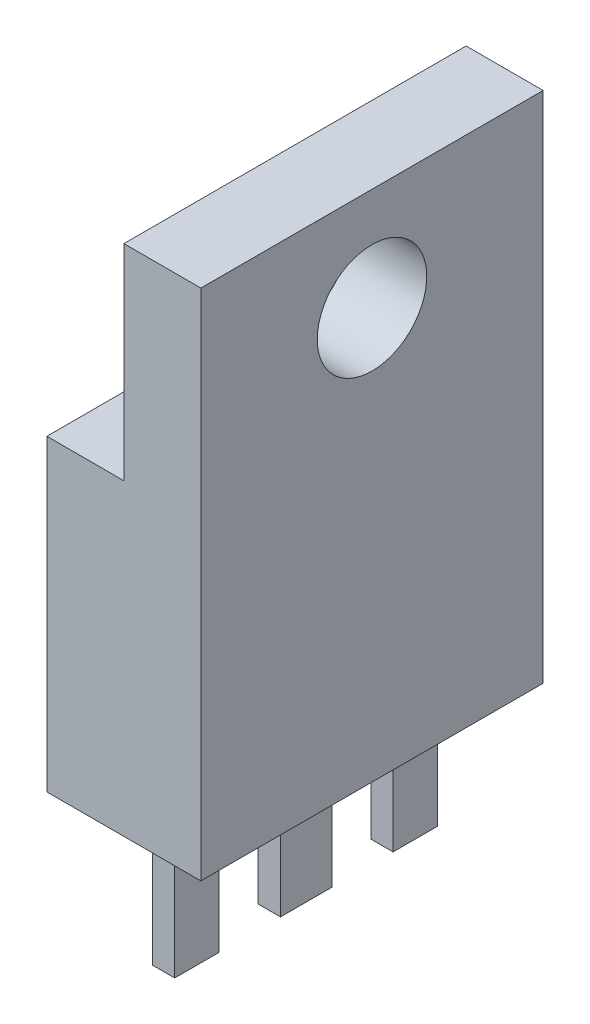
ISO-10303-21;
HEADER;
FILE_DESCRIPTION(('STEP AP214'),'2;1');
FILE_NAME('part.step','',(''),(''),'','','');
FILE_SCHEMA(('AUTOMOTIVE_DESIGN { 1 0 10303 214 1 1 1 1 }'));
ENDSEC;
DATA;
#1=APPLICATION_CONTEXT('core data for automotive mechanical design processes');
#2=APPLICATION_PROTOCOL_DEFINITION('international standard','automotive_design',2000,#1);
#3=PRODUCT_CONTEXT('',#1,'mechanical');
#4=PRODUCT('Part','Part','',(#3));
#5=PRODUCT_RELATED_PRODUCT_CATEGORY('part','',(#4));
#6=PRODUCT_DEFINITION_FORMATION('','',#4);
#7=PRODUCT_DEFINITION_CONTEXT('part definition',#1,'design');
#8=PRODUCT_DEFINITION('design','',#6,#7);
#9=PRODUCT_DEFINITION_SHAPE('','',#8);
#10=(LENGTH_UNIT() NAMED_UNIT(*) SI_UNIT(.MILLI.,.METRE.));
#11=(NAMED_UNIT(*) PLANE_ANGLE_UNIT() SI_UNIT($,.RADIAN.));
#12=(NAMED_UNIT(*) SI_UNIT($,.STERADIAN.) SOLID_ANGLE_UNIT());
#13=UNCERTAINTY_MEASURE_WITH_UNIT(LENGTH_MEASURE(1.E-05),#10,'distance_accuracy_value','');
#14=(GEOMETRIC_REPRESENTATION_CONTEXT(3) GLOBAL_UNCERTAINTY_ASSIGNED_CONTEXT((#13)) GLOBAL_UNIT_ASSIGNED_CONTEXT((#10,
#11,#12)) REPRESENTATION_CONTEXT('',''));
#15=CARTESIAN_POINT('',(0.,0.,0.));
#16=DIRECTION('',(0.,0.,1.));
#17=DIRECTION('',(1.,0.,0.));
#18=AXIS2_PLACEMENT_3D('',#15,#16,#17);
#19=CARTESIAN_POINT('',(0.,0.,0.));
#20=DIRECTION('',(0.,-1.,0.));
#21=DIRECTION('',(0.,0.,-1.));
#22=AXIS2_PLACEMENT_3D('',#19,#20,#21);
#23=PLANE('',#22);
#24=DIRECTION('',(0.,0.,1.));
#25=VECTOR('',#24,1.);
#26=CARTESIAN_POINT('',(0.,0.,0.));
#27=LINE('',#26,#25);
#28=CARTESIAN_POINT('',(0.,0.,-10.));
#29=VERTEX_POINT('',#28);
#30=CARTESIAN_POINT('',(0.,0.,0.));
#31=VERTEX_POINT('',#30);
#32=EDGE_CURVE('E277',#29,#31,#27,.T.);
#33=ORIENTED_EDGE('',*,*,#32,.F.);
#34=DIRECTION('',(-1.,0.,0.));
#35=VECTOR('',#34,1.);
#36=CARTESIAN_POINT('',(0.,0.,-10.));
#37=LINE('',#36,#35);
#38=CARTESIAN_POINT('',(4.5,0.,-10.));
#39=VERTEX_POINT('',#38);
#40=EDGE_CURVE('E282',#39,#29,#37,.T.);
#41=ORIENTED_EDGE('',*,*,#40,.F.);
#42=DIRECTION('',(0.,0.,-1.));
#43=VECTOR('',#42,1.);
#44=CARTESIAN_POINT('',(4.5,0.,0.));
#45=LINE('',#44,#43);
#46=CARTESIAN_POINT('',(4.5,0.,0.));
#47=VERTEX_POINT('',#46);
#48=EDGE_CURVE('E291',#47,#39,#45,.T.);
#49=ORIENTED_EDGE('',*,*,#48,.F.);
#50=DIRECTION('',(1.,0.,0.));
#51=VECTOR('',#50,1.);
#52=CARTESIAN_POINT('',(0.,0.,0.));
#53=LINE('',#52,#51);
#54=EDGE_CURVE('E289',#31,#47,#53,.T.);
#55=ORIENTED_EDGE('',*,*,#54,.F.);
#56=EDGE_LOOP('',(#33,#41,#49,#55));
#57=FACE_BOUND('',#56,.T.);
#58=DIRECTION('',(1.,0.,0.));
#59=VECTOR('',#58,1.);
#60=CARTESIAN_POINT('',(1.925,0.,-2.46));
#61=LINE('',#60,#59);
#62=CARTESIAN_POINT('',(1.925,0.,-2.46));
#63=VERTEX_POINT('',#62);
#64=CARTESIAN_POINT('',(2.575,0.,-2.46));
#65=VERTEX_POINT('',#64);
#66=EDGE_CURVE('E237',#63,#65,#61,.T.);
#67=ORIENTED_EDGE('',*,*,#66,.F.);
#68=DIRECTION('',(0.,0.,-1.));
#69=VECTOR('',#68,1.);
#70=CARTESIAN_POINT('',(1.925,0.,-1.16));
#71=LINE('',#70,#69);
#72=CARTESIAN_POINT('',(1.925,0.,-1.16));
#73=VERTEX_POINT('',#72);
#74=EDGE_CURVE('E223',#73,#63,#71,.T.);
#75=ORIENTED_EDGE('',*,*,#74,.F.);
#76=DIRECTION('',(-1.,0.,0.));
#77=VECTOR('',#76,1.);
#78=CARTESIAN_POINT('',(1.925,0.,-1.16));
#79=LINE('',#78,#77);
#80=CARTESIAN_POINT('',(2.575,0.,-1.16));
#81=VERTEX_POINT('',#80);
#82=EDGE_CURVE('E228',#81,#73,#79,.T.);
#83=ORIENTED_EDGE('',*,*,#82,.F.);
#84=DIRECTION('',(0.,0.,1.));
#85=VECTOR('',#84,1.);
#86=CARTESIAN_POINT('',(2.575,0.,-1.16));
#87=LINE('',#86,#85);
#88=EDGE_CURVE('E239',#65,#81,#87,.T.);
#89=ORIENTED_EDGE('',*,*,#88,.F.);
#90=EDGE_LOOP('',(#67,#75,#83,#89));
#91=FACE_BOUND('',#90,.T.);
#92=DIRECTION('',(1.,0.,0.));
#93=VECTOR('',#92,1.);
#94=CARTESIAN_POINT('',(1.925,0.,-5.75));
#95=LINE('',#94,#93);
#96=CARTESIAN_POINT('',(1.925,0.,-5.75));
#97=VERTEX_POINT('',#96);
#98=CARTESIAN_POINT('',(2.575,0.,-5.75));
#99=VERTEX_POINT('',#98);
#100=EDGE_CURVE('E195',#97,#99,#95,.T.);
#101=ORIENTED_EDGE('',*,*,#100,.F.);
#102=DIRECTION('',(0.,0.,-1.));
#103=VECTOR('',#102,1.);
#104=CARTESIAN_POINT('',(1.925,0.,-4.25));
#105=LINE('',#104,#103);
#106=CARTESIAN_POINT('',(1.925,0.,-4.25));
#107=VERTEX_POINT('',#106);
#108=EDGE_CURVE('E192',#107,#97,#105,.T.);
#109=ORIENTED_EDGE('',*,*,#108,.F.);
#110=DIRECTION('',(-1.,0.,0.));
#111=VECTOR('',#110,1.);
#112=CARTESIAN_POINT('',(1.925,0.,-4.25));
#113=LINE('',#112,#111);
#114=CARTESIAN_POINT('',(2.575,0.,-4.25));
#115=VERTEX_POINT('',#114);
#116=EDGE_CURVE('E204',#115,#107,#113,.T.);
#117=ORIENTED_EDGE('',*,*,#116,.F.);
#118=DIRECTION('',(0.,0.,1.));
#119=VECTOR('',#118,1.);
#120=CARTESIAN_POINT('',(2.575,0.,-4.25));
#121=LINE('',#120,#119);
#122=EDGE_CURVE('E212',#99,#115,#121,.T.);
#123=ORIENTED_EDGE('',*,*,#122,.F.);
#124=EDGE_LOOP('',(#101,#109,#117,#123));
#125=FACE_BOUND('',#124,.T.);
#126=DIRECTION('',(1.,0.,0.));
#127=VECTOR('',#126,1.);
#128=CARTESIAN_POINT('',(1.925,0.,-8.84));
#129=LINE('',#128,#127);
#130=CARTESIAN_POINT('',(1.925,0.,-8.84));
#131=VERTEX_POINT('',#130);
#132=CARTESIAN_POINT('',(2.575,0.,-8.84));
#133=VERTEX_POINT('',#132);
#134=EDGE_CURVE('E566',#131,#133,#129,.T.);
#135=ORIENTED_EDGE('',*,*,#134,.F.);
#136=DIRECTION('',(0.,0.,-1.));
#137=VECTOR('',#136,1.);
#138=CARTESIAN_POINT('',(1.925,0.,-7.54));
#139=LINE('',#138,#137);
#140=CARTESIAN_POINT('',(1.925,0.,-7.54));
#141=VERTEX_POINT('',#140);
#142=EDGE_CURVE('E190',#141,#131,#139,.T.);
#143=ORIENTED_EDGE('',*,*,#142,.F.);
#144=DIRECTION('',(-1.,0.,0.));
#145=VECTOR('',#144,1.);
#146=CARTESIAN_POINT('',(1.925,0.,-7.54));
#147=LINE('',#146,#145);
#148=CARTESIAN_POINT('',(2.575,0.,-7.54));
#149=VERTEX_POINT('',#148);
#150=EDGE_CURVE('E186',#149,#141,#147,.T.);
#151=ORIENTED_EDGE('',*,*,#150,.F.);
#152=DIRECTION('',(0.,0.,1.));
#153=VECTOR('',#152,1.);
#154=CARTESIAN_POINT('',(2.575,0.,-7.54));
#155=LINE('',#154,#153);
#156=EDGE_CURVE('E563',#133,#149,#155,.T.);
#157=ORIENTED_EDGE('',*,*,#156,.F.);
#158=EDGE_LOOP('',(#135,#143,#151,#157));
#159=FACE_BOUND('',#158,.T.);
#160=ADVANCED_FACE('F41',(#57,#91,#125,#159),#23,.T.);
#161=CARTESIAN_POINT('',(0.,9.,0.));
#162=DIRECTION('',(0.,-1.,0.));
#163=DIRECTION('',(0.,0.,-1.));
#164=AXIS2_PLACEMENT_3D('',#161,#162,#163);
#165=PLANE('',#164);
#166=DIRECTION('',(0.,0.,1.));
#167=VECTOR('',#166,1.);
#168=CARTESIAN_POINT('',(2.25,9.,-10.));
#169=LINE('',#168,#167);
#170=CARTESIAN_POINT('',(2.25,9.,-10.));
#171=VERTEX_POINT('',#170);
#172=CARTESIAN_POINT('',(2.25,9.,0.));
#173=VERTEX_POINT('',#172);
#174=EDGE_CURVE('E256',#171,#173,#169,.T.);
#175=ORIENTED_EDGE('',*,*,#174,.F.);
#176=DIRECTION('',(-1.,0.,0.));
#177=VECTOR('',#176,1.);
#178=CARTESIAN_POINT('',(0.,9.,-10.));
#179=LINE('',#178,#177);
#180=CARTESIAN_POINT('',(0.,9.,-10.));
#181=VERTEX_POINT('',#180);
#182=EDGE_CURVE('E284',#171,#181,#179,.T.);
#183=ORIENTED_EDGE('',*,*,#182,.T.);
#184=DIRECTION('',(0.,0.,1.));
#185=VECTOR('',#184,1.);
#186=CARTESIAN_POINT('',(0.,9.,0.));
#187=LINE('',#186,#185);
#188=CARTESIAN_POINT('',(0.,9.,0.));
#189=VERTEX_POINT('',#188);
#190=EDGE_CURVE('E278',#181,#189,#187,.T.);
#191=ORIENTED_EDGE('',*,*,#190,.T.);
#192=DIRECTION('',(1.,0.,0.));
#193=VECTOR('',#192,1.);
#194=CARTESIAN_POINT('',(0.,9.,0.));
#195=LINE('',#194,#193);
#196=EDGE_CURVE('E281',#189,#173,#195,.T.);
#197=ORIENTED_EDGE('',*,*,#196,.T.);
#198=EDGE_LOOP('',(#175,#183,#191,#197));
#199=FACE_BOUND('',#198,.T.);
#200=ADVANCED_FACE('F318',(#199),#165,.F.);
#201=CARTESIAN_POINT('',(0.,9.,0.));
#202=DIRECTION('',(1.,0.,0.));
#203=DIRECTION('',(0.,0.,-1.));
#204=AXIS2_PLACEMENT_3D('',#201,#202,#203);
#205=PLANE('',#204);
#206=ORIENTED_EDGE('',*,*,#32,.T.);
#207=DIRECTION('',(0.,-1.,0.));
#208=VECTOR('',#207,1.);
#209=CARTESIAN_POINT('',(0.,9.,0.));
#210=LINE('',#209,#208);
#211=EDGE_CURVE('E11',#189,#31,#210,.T.);
#212=ORIENTED_EDGE('',*,*,#211,.F.);
#213=ORIENTED_EDGE('',*,*,#190,.F.);
#214=DIRECTION('',(0.,-1.,0.));
#215=VECTOR('',#214,1.);
#216=CARTESIAN_POINT('',(0.,9.,-10.));
#217=LINE('',#216,#215);
#218=EDGE_CURVE('E286',#181,#29,#217,.T.);
#219=ORIENTED_EDGE('',*,*,#218,.T.);
#220=EDGE_LOOP('',(#206,#212,#213,#219));
#221=FACE_BOUND('',#220,.T.);
#222=ADVANCED_FACE('F43',(#221),#205,.F.);
#223=CARTESIAN_POINT('',(0.,9.,0.));
#224=DIRECTION('',(0.,0.,-1.));
#225=DIRECTION('',(-1.,0.,0.));
#226=AXIS2_PLACEMENT_3D('',#223,#224,#225);
#227=PLANE('',#226);
#228=ORIENTED_EDGE('',*,*,#54,.T.);
#229=DIRECTION('',(0.,-1.,0.));
#230=VECTOR('',#229,1.);
#231=CARTESIAN_POINT('',(4.5,9.,0.));
#232=LINE('',#231,#230);
#233=CARTESIAN_POINT('',(4.5,15.,0.));
#234=VERTEX_POINT('',#233);
#235=EDGE_CURVE('E49',#234,#47,#232,.T.);
#236=ORIENTED_EDGE('',*,*,#235,.F.);
#237=DIRECTION('',(1.,0.,0.));
#238=VECTOR('',#237,1.);
#239=CARTESIAN_POINT('',(4.5,15.,0.));
#240=LINE('',#239,#238);
#241=CARTESIAN_POINT('',(2.25,15.,0.));
#242=VERTEX_POINT('',#241);
#243=EDGE_CURVE('E266',#242,#234,#240,.T.);
#244=ORIENTED_EDGE('',*,*,#243,.F.);
#245=DIRECTION('',(0.,-1.,0.));
#246=VECTOR('',#245,1.);
#247=CARTESIAN_POINT('',(2.25,15.,0.));
#248=LINE('',#247,#246);
#249=EDGE_CURVE('E269',#242,#173,#248,.T.);
#250=ORIENTED_EDGE('',*,*,#249,.T.);
#251=ORIENTED_EDGE('',*,*,#196,.F.);
#252=ORIENTED_EDGE('',*,*,#211,.T.);
#253=EDGE_LOOP('',(#228,#236,#244,#250,#251,#252));
#254=FACE_BOUND('',#253,.T.);
#255=ADVANCED_FACE('F326',(#254),#227,.F.);
#256=CARTESIAN_POINT('',(4.5,9.,0.));
#257=DIRECTION('',(-1.,0.,0.));
#258=DIRECTION('',(0.,0.,1.));
#259=AXIS2_PLACEMENT_3D('',#256,#257,#258);
#260=PLANE('',#259);
#261=CARTESIAN_POINT('',(4.5,12.,-5.));
#262=DIRECTION('',(-1.,0.,0.));
#263=DIRECTION('',(0.,0.,1.));
#264=AXIS2_PLACEMENT_3D('',#261,#262,#263);
#265=CIRCLE('',#264,1.6);
#266=CARTESIAN_POINT('',(4.5,12.,-3.4));
#267=VERTEX_POINT('',#266);
#268=EDGE_CURVE('E253',#267,#267,#265,.T.);
#269=ORIENTED_EDGE('',*,*,#268,.T.);
#270=EDGE_LOOP('',(#269));
#271=FACE_BOUND('',#270,.T.);
#272=ORIENTED_EDGE('',*,*,#48,.T.);
#273=DIRECTION('',(0.,-1.,0.));
#274=VECTOR('',#273,1.);
#275=CARTESIAN_POINT('',(4.5,9.,-10.));
#276=LINE('',#275,#274);
#277=CARTESIAN_POINT('',(4.5,15.,-10.));
#278=VERTEX_POINT('',#277);
#279=EDGE_CURVE('E296',#278,#39,#276,.T.);
#280=ORIENTED_EDGE('',*,*,#279,.F.);
#281=DIRECTION('',(0.,0.,-1.));
#282=VECTOR('',#281,1.);
#283=CARTESIAN_POINT('',(4.5,15.,-10.));
#284=LINE('',#283,#282);
#285=EDGE_CURVE('E259',#234,#278,#284,.T.);
#286=ORIENTED_EDGE('',*,*,#285,.F.);
#287=ORIENTED_EDGE('',*,*,#235,.T.);
#288=EDGE_LOOP('',(#272,#280,#286,#287));
#289=FACE_BOUND('',#288,.T.);
#290=ADVANCED_FACE('F302',(#271,#289),#260,.F.);
#291=CARTESIAN_POINT('',(0.,9.,-10.));
#292=DIRECTION('',(0.,0.,1.));
#293=DIRECTION('',(1.,0.,0.));
#294=AXIS2_PLACEMENT_3D('',#291,#292,#293);
#295=PLANE('',#294);
#296=ORIENTED_EDGE('',*,*,#40,.T.);
#297=ORIENTED_EDGE('',*,*,#218,.F.);
#298=ORIENTED_EDGE('',*,*,#182,.F.);
#299=DIRECTION('',(0.,-1.,0.));
#300=VECTOR('',#299,1.);
#301=CARTESIAN_POINT('',(2.25,15.,-10.));
#302=LINE('',#301,#300);
#303=CARTESIAN_POINT('',(2.25,15.,-10.));
#304=VERTEX_POINT('',#303);
#305=EDGE_CURVE('E274',#304,#171,#302,.T.);
#306=ORIENTED_EDGE('',*,*,#305,.F.);
#307=DIRECTION('',(-1.,0.,0.));
#308=VECTOR('',#307,1.);
#309=CARTESIAN_POINT('',(4.5,15.,-10.));
#310=LINE('',#309,#308);
#311=EDGE_CURVE('E262',#278,#304,#310,.T.);
#312=ORIENTED_EDGE('',*,*,#311,.F.);
#313=ORIENTED_EDGE('',*,*,#279,.T.);
#314=EDGE_LOOP('',(#296,#297,#298,#306,#312,#313));
#315=FACE_BOUND('',#314,.T.);
#316=ADVANCED_FACE('F311',(#315),#295,.F.);
#317=CARTESIAN_POINT('',(2.25,15.,-10.));
#318=DIRECTION('',(1.,0.,0.));
#319=DIRECTION('',(0.,0.,-1.));
#320=AXIS2_PLACEMENT_3D('',#317,#318,#319);
#321=PLANE('',#320);
#322=CARTESIAN_POINT('',(2.25,12.,-5.));
#323=DIRECTION('',(-1.,0.,0.));
#324=DIRECTION('',(0.,0.,1.));
#325=AXIS2_PLACEMENT_3D('',#322,#323,#324);
#326=CIRCLE('',#325,1.6);
#327=CARTESIAN_POINT('',(2.25,12.,-3.4));
#328=VERTEX_POINT('',#327);
#329=EDGE_CURVE('E252',#328,#328,#326,.T.);
#330=ORIENTED_EDGE('',*,*,#329,.F.);
#331=EDGE_LOOP('',(#330));
#332=FACE_BOUND('',#331,.T.);
#333=ORIENTED_EDGE('',*,*,#174,.T.);
#334=ORIENTED_EDGE('',*,*,#249,.F.);
#335=DIRECTION('',(0.,0.,1.));
#336=VECTOR('',#335,1.);
#337=CARTESIAN_POINT('',(2.25,15.,-10.));
#338=LINE('',#337,#336);
#339=EDGE_CURVE('E264',#304,#242,#338,.T.);
#340=ORIENTED_EDGE('',*,*,#339,.F.);
#341=ORIENTED_EDGE('',*,*,#305,.T.);
#342=EDGE_LOOP('',(#333,#334,#340,#341));
#343=FACE_BOUND('',#342,.T.);
#344=ADVANCED_FACE('F322',(#332,#343),#321,.F.);
#345=CARTESIAN_POINT('',(0.,15.,0.));
#346=DIRECTION('',(0.,-1.,0.));
#347=DIRECTION('',(0.,0.,-1.));
#348=AXIS2_PLACEMENT_3D('',#345,#346,#347);
#349=PLANE('',#348);
#350=ORIENTED_EDGE('',*,*,#285,.T.);
#351=ORIENTED_EDGE('',*,*,#311,.T.);
#352=ORIENTED_EDGE('',*,*,#339,.T.);
#353=ORIENTED_EDGE('',*,*,#243,.T.);
#354=EDGE_LOOP('',(#350,#351,#352,#353));
#355=FACE_BOUND('',#354,.T.);
#356=ADVANCED_FACE('F325',(#355),#349,.F.);
#357=CARTESIAN_POINT('',(4.5,12.,-5.));
#358=DIRECTION('',(-1.,0.,0.));
#359=DIRECTION('',(0.,0.,1.));
#360=AXIS2_PLACEMENT_3D('',#357,#358,#359);
#361=CYLINDRICAL_SURFACE('',#360,1.6);
#362=ORIENTED_EDGE('',*,*,#268,.F.);
#363=EDGE_LOOP('',(#362));
#364=FACE_BOUND('',#363,.T.);
#365=ORIENTED_EDGE('',*,*,#329,.T.);
#366=EDGE_LOOP('',(#365));
#367=FACE_BOUND('',#366,.T.);
#368=ADVANCED_FACE('F350',(#364,#367),#361,.F.);
#369=CARTESIAN_POINT('',(1.925,-4.,-1.16));
#370=DIRECTION('',(1.,0.,0.));
#371=DIRECTION('',(0.,0.,-1.));
#372=AXIS2_PLACEMENT_3D('',#369,#370,#371);
#373=PLANE('',#372);
#374=ORIENTED_EDGE('',*,*,#74,.T.);
#375=DIRECTION('',(0.,1.,0.));
#376=VECTOR('',#375,1.);
#377=CARTESIAN_POINT('',(1.925,-4.,-2.46));
#378=LINE('',#377,#376);
#379=CARTESIAN_POINT('',(1.925,-4.,-2.46));
#380=VERTEX_POINT('',#379);
#381=EDGE_CURVE('E250',#380,#63,#378,.T.);
#382=ORIENTED_EDGE('',*,*,#381,.F.);
#383=DIRECTION('',(0.,0.,-1.));
#384=VECTOR('',#383,1.);
#385=CARTESIAN_POINT('',(1.925,-4.,-1.16));
#386=LINE('',#385,#384);
#387=CARTESIAN_POINT('',(1.925,-4.,-1.16));
#388=VERTEX_POINT('',#387);
#389=EDGE_CURVE('E224',#388,#380,#386,.T.);
#390=ORIENTED_EDGE('',*,*,#389,.F.);
#391=DIRECTION('',(0.,1.,0.));
#392=VECTOR('',#391,1.);
#393=CARTESIAN_POINT('',(1.925,-4.,-1.16));
#394=LINE('',#393,#392);
#395=EDGE_CURVE('E234',#388,#73,#394,.T.);
#396=ORIENTED_EDGE('',*,*,#395,.T.);
#397=EDGE_LOOP('',(#374,#382,#390,#396));
#398=FACE_BOUND('',#397,.T.);
#399=ADVANCED_FACE('F356',(#398),#373,.F.);
#400=CARTESIAN_POINT('',(1.925,-4.,-2.46));
#401=DIRECTION('',(0.,0.,1.));
#402=DIRECTION('',(1.,0.,0.));
#403=AXIS2_PLACEMENT_3D('',#400,#401,#402);
#404=PLANE('',#403);
#405=ORIENTED_EDGE('',*,*,#66,.T.);
#406=DIRECTION('',(0.,1.,0.));
#407=VECTOR('',#406,1.);
#408=CARTESIAN_POINT('',(2.575,-4.,-2.46));
#409=LINE('',#408,#407);
#410=CARTESIAN_POINT('',(2.575,-4.,-2.46));
#411=VERTEX_POINT('',#410);
#412=EDGE_CURVE('E247',#411,#65,#409,.T.);
#413=ORIENTED_EDGE('',*,*,#412,.F.);
#414=DIRECTION('',(1.,0.,0.));
#415=VECTOR('',#414,1.);
#416=CARTESIAN_POINT('',(1.925,-4.,-2.46));
#417=LINE('',#416,#415);
#418=EDGE_CURVE('E227',#380,#411,#417,.T.);
#419=ORIENTED_EDGE('',*,*,#418,.F.);
#420=ORIENTED_EDGE('',*,*,#381,.T.);
#421=EDGE_LOOP('',(#405,#413,#419,#420));
#422=FACE_BOUND('',#421,.T.);
#423=ADVANCED_FACE('F360',(#422),#404,.F.);
#424=CARTESIAN_POINT('',(2.575,-4.,-1.16));
#425=DIRECTION('',(-1.,0.,0.));
#426=DIRECTION('',(0.,0.,1.));
#427=AXIS2_PLACEMENT_3D('',#424,#425,#426);
#428=PLANE('',#427);
#429=ORIENTED_EDGE('',*,*,#88,.T.);
#430=DIRECTION('',(0.,1.,0.));
#431=VECTOR('',#430,1.);
#432=CARTESIAN_POINT('',(2.575,-4.,-1.16));
#433=LINE('',#432,#431);
#434=CARTESIAN_POINT('',(2.575,-4.,-1.16));
#435=VERTEX_POINT('',#434);
#436=EDGE_CURVE('E245',#435,#81,#433,.T.);
#437=ORIENTED_EDGE('',*,*,#436,.F.);
#438=DIRECTION('',(0.,0.,1.));
#439=VECTOR('',#438,1.);
#440=CARTESIAN_POINT('',(2.575,-4.,-1.16));
#441=LINE('',#440,#439);
#442=EDGE_CURVE('E230',#411,#435,#441,.T.);
#443=ORIENTED_EDGE('',*,*,#442,.F.);
#444=ORIENTED_EDGE('',*,*,#412,.T.);
#445=EDGE_LOOP('',(#429,#437,#443,#444));
#446=FACE_BOUND('',#445,.T.);
#447=ADVANCED_FACE('F364',(#446),#428,.F.);
#448=CARTESIAN_POINT('',(1.925,-4.,-1.16));
#449=DIRECTION('',(0.,0.,-1.));
#450=DIRECTION('',(-1.,0.,0.));
#451=AXIS2_PLACEMENT_3D('',#448,#449,#450);
#452=PLANE('',#451);
#453=ORIENTED_EDGE('',*,*,#82,.T.);
#454=ORIENTED_EDGE('',*,*,#395,.F.);
#455=DIRECTION('',(-1.,0.,0.));
#456=VECTOR('',#455,1.);
#457=CARTESIAN_POINT('',(1.925,-4.,-1.16));
#458=LINE('',#457,#456);
#459=EDGE_CURVE('E232',#435,#388,#458,.T.);
#460=ORIENTED_EDGE('',*,*,#459,.F.);
#461=ORIENTED_EDGE('',*,*,#436,.T.);
#462=EDGE_LOOP('',(#453,#454,#460,#461));
#463=FACE_BOUND('',#462,.T.);
#464=ADVANCED_FACE('F368',(#463),#452,.F.);
#465=CARTESIAN_POINT('',(0.,-4.,0.));
#466=DIRECTION('',(0.,-1.,0.));
#467=DIRECTION('',(0.,0.,-1.));
#468=AXIS2_PLACEMENT_3D('',#465,#466,#467);
#469=PLANE('',#468);
#470=ORIENTED_EDGE('',*,*,#389,.T.);
#471=ORIENTED_EDGE('',*,*,#418,.T.);
#472=ORIENTED_EDGE('',*,*,#442,.T.);
#473=ORIENTED_EDGE('',*,*,#459,.T.);
#474=EDGE_LOOP('',(#470,#471,#472,#473));
#475=FACE_BOUND('',#474,.T.);
#476=ADVANCED_FACE('F372',(#475),#469,.T.);
#477=CARTESIAN_POINT('',(1.925,-4.,-4.25));
#478=DIRECTION('',(1.,0.,0.));
#479=DIRECTION('',(0.,0.,-1.));
#480=AXIS2_PLACEMENT_3D('',#477,#478,#479);
#481=PLANE('',#480);
#482=ORIENTED_EDGE('',*,*,#108,.T.);
#483=DIRECTION('',(0.,1.,0.));
#484=VECTOR('',#483,1.);
#485=CARTESIAN_POINT('',(1.925,-4.,-5.75));
#486=LINE('',#485,#484);
#487=CARTESIAN_POINT('',(1.925,-4.,-5.75));
#488=VERTEX_POINT('',#487);
#489=EDGE_CURVE('E221',#488,#97,#486,.T.);
#490=ORIENTED_EDGE('',*,*,#489,.F.);
#491=DIRECTION('',(0.,0.,-1.));
#492=VECTOR('',#491,1.);
#493=CARTESIAN_POINT('',(1.925,-4.,-4.25));
#494=LINE('',#493,#492);
#495=CARTESIAN_POINT('',(1.925,-4.,-4.25));
#496=VERTEX_POINT('',#495);
#497=EDGE_CURVE('E200',#496,#488,#494,.T.);
#498=ORIENTED_EDGE('',*,*,#497,.F.);
#499=DIRECTION('',(0.,1.,0.));
#500=VECTOR('',#499,1.);
#501=CARTESIAN_POINT('',(1.925,-4.,-4.25));
#502=LINE('',#501,#500);
#503=EDGE_CURVE('E209',#496,#107,#502,.T.);
#504=ORIENTED_EDGE('',*,*,#503,.T.);
#505=EDGE_LOOP('',(#482,#490,#498,#504));
#506=FACE_BOUND('',#505,.T.);
#507=ADVANCED_FACE('F376',(#506),#481,.F.);
#508=CARTESIAN_POINT('',(1.925,-4.,-5.75));
#509=DIRECTION('',(0.,0.,1.));
#510=DIRECTION('',(1.,0.,0.));
#511=AXIS2_PLACEMENT_3D('',#508,#509,#510);
#512=PLANE('',#511);
#513=ORIENTED_EDGE('',*,*,#100,.T.);
#514=DIRECTION('',(0.,1.,0.));
#515=VECTOR('',#514,1.);
#516=CARTESIAN_POINT('',(2.575,-4.,-5.75));
#517=LINE('',#516,#515);
#518=CARTESIAN_POINT('',(2.575,-4.,-5.75));
#519=VERTEX_POINT('',#518);
#520=EDGE_CURVE('E218',#519,#99,#517,.T.);
#521=ORIENTED_EDGE('',*,*,#520,.F.);
#522=DIRECTION('',(1.,0.,0.));
#523=VECTOR('',#522,1.);
#524=CARTESIAN_POINT('',(1.925,-4.,-5.75));
#525=LINE('',#524,#523);
#526=EDGE_CURVE('E203',#488,#519,#525,.T.);
#527=ORIENTED_EDGE('',*,*,#526,.F.);
#528=ORIENTED_EDGE('',*,*,#489,.T.);
#529=EDGE_LOOP('',(#513,#521,#527,#528));
#530=FACE_BOUND('',#529,.T.);
#531=ADVANCED_FACE('F380',(#530),#512,.F.);
#532=CARTESIAN_POINT('',(2.575,-4.,-4.25));
#533=DIRECTION('',(-1.,0.,0.));
#534=DIRECTION('',(0.,0.,1.));
#535=AXIS2_PLACEMENT_3D('',#532,#533,#534);
#536=PLANE('',#535);
#537=ORIENTED_EDGE('',*,*,#122,.T.);
#538=DIRECTION('',(0.,1.,0.));
#539=VECTOR('',#538,1.);
#540=CARTESIAN_POINT('',(2.575,-4.,-4.25));
#541=LINE('',#540,#539);
#542=CARTESIAN_POINT('',(2.575,-4.,-4.25));
#543=VERTEX_POINT('',#542);
#544=EDGE_CURVE('E64',#543,#115,#541,.T.);
#545=ORIENTED_EDGE('',*,*,#544,.F.);
#546=DIRECTION('',(0.,0.,1.));
#547=VECTOR('',#546,1.);
#548=CARTESIAN_POINT('',(2.575,-4.,-4.25));
#549=LINE('',#548,#547);
#550=EDGE_CURVE('E206',#519,#543,#549,.T.);
#551=ORIENTED_EDGE('',*,*,#550,.F.);
#552=ORIENTED_EDGE('',*,*,#520,.T.);
#553=EDGE_LOOP('',(#537,#545,#551,#552));
#554=FACE_BOUND('',#553,.T.);
#555=ADVANCED_FACE('F384',(#554),#536,.F.);
#556=CARTESIAN_POINT('',(1.925,-4.,-4.25));
#557=DIRECTION('',(0.,0.,-1.));
#558=DIRECTION('',(-1.,0.,0.));
#559=AXIS2_PLACEMENT_3D('',#556,#557,#558);
#560=PLANE('',#559);
#561=ORIENTED_EDGE('',*,*,#116,.T.);
#562=ORIENTED_EDGE('',*,*,#503,.F.);
#563=DIRECTION('',(-1.,0.,0.));
#564=VECTOR('',#563,1.);
#565=CARTESIAN_POINT('',(1.925,-4.,-4.25));
#566=LINE('',#565,#564);
#567=EDGE_CURVE('E208',#543,#496,#566,.T.);
#568=ORIENTED_EDGE('',*,*,#567,.F.);
#569=ORIENTED_EDGE('',*,*,#544,.T.);
#570=EDGE_LOOP('',(#561,#562,#568,#569));
#571=FACE_BOUND('',#570,.T.);
#572=ADVANCED_FACE('F388',(#571),#560,.F.);
#573=CARTESIAN_POINT('',(0.,-4.,0.));
#574=DIRECTION('',(0.,-1.,0.));
#575=DIRECTION('',(0.,0.,-1.));
#576=AXIS2_PLACEMENT_3D('',#573,#574,#575);
#577=PLANE('',#576);
#578=ORIENTED_EDGE('',*,*,#497,.T.);
#579=ORIENTED_EDGE('',*,*,#526,.T.);
#580=ORIENTED_EDGE('',*,*,#550,.T.);
#581=ORIENTED_EDGE('',*,*,#567,.T.);
#582=EDGE_LOOP('',(#578,#579,#580,#581));
#583=FACE_BOUND('',#582,.T.);
#584=ADVANCED_FACE('F392',(#583),#577,.T.);
#585=CARTESIAN_POINT('',(1.925,-4.,-7.54));
#586=DIRECTION('',(1.,0.,0.));
#587=DIRECTION('',(0.,0.,-1.));
#588=AXIS2_PLACEMENT_3D('',#585,#586,#587);
#589=PLANE('',#588);
#590=ORIENTED_EDGE('',*,*,#142,.T.);
#591=DIRECTION('',(0.,1.,0.));
#592=VECTOR('',#591,1.);
#593=CARTESIAN_POINT('',(1.925,-4.,-8.84));
#594=LINE('',#593,#592);
#595=CARTESIAN_POINT('',(1.925,-4.,-8.84));
#596=VERTEX_POINT('',#595);
#597=EDGE_CURVE('E171',#596,#131,#594,.T.);
#598=ORIENTED_EDGE('',*,*,#597,.F.);
#599=DIRECTION('',(0.,0.,-1.));
#600=VECTOR('',#599,1.);
#601=CARTESIAN_POINT('',(1.925,-4.,-7.54));
#602=LINE('',#601,#600);
#603=CARTESIAN_POINT('',(1.925,-4.,-7.54));
#604=VERTEX_POINT('',#603);
#605=EDGE_CURVE('E178',#604,#596,#602,.T.);
#606=ORIENTED_EDGE('',*,*,#605,.F.);
#607=DIRECTION('',(0.,1.,0.));
#608=VECTOR('',#607,1.);
#609=CARTESIAN_POINT('',(1.925,-4.,-7.54));
#610=LINE('',#609,#608);
#611=EDGE_CURVE('E560',#604,#141,#610,.T.);
#612=ORIENTED_EDGE('',*,*,#611,.T.);
#613=EDGE_LOOP('',(#590,#598,#606,#612));
#614=FACE_BOUND('',#613,.T.);
#615=ADVANCED_FACE('F188',(#614),#589,.F.);
#616=CARTESIAN_POINT('',(1.925,-4.,-8.84));
#617=DIRECTION('',(0.,0.,1.));
#618=DIRECTION('',(1.,0.,0.));
#619=AXIS2_PLACEMENT_3D('',#616,#617,#618);
#620=PLANE('',#619);
#621=ORIENTED_EDGE('',*,*,#134,.T.);
#622=DIRECTION('',(0.,1.,0.));
#623=VECTOR('',#622,1.);
#624=CARTESIAN_POINT('',(2.575,-4.,-8.84));
#625=LINE('',#624,#623);
#626=CARTESIAN_POINT('',(2.575,-4.,-8.84));
#627=VERTEX_POINT('',#626);
#628=EDGE_CURVE('E174',#627,#133,#625,.T.);
#629=ORIENTED_EDGE('',*,*,#628,.F.);
#630=DIRECTION('',(1.,0.,0.));
#631=VECTOR('',#630,1.);
#632=CARTESIAN_POINT('',(1.925,-4.,-8.84));
#633=LINE('',#632,#631);
#634=EDGE_CURVE('E167',#596,#627,#633,.T.);
#635=ORIENTED_EDGE('',*,*,#634,.F.);
#636=ORIENTED_EDGE('',*,*,#597,.T.);
#637=EDGE_LOOP('',(#621,#629,#635,#636));
#638=FACE_BOUND('',#637,.T.);
#639=ADVANCED_FACE('F169',(#638),#620,.F.);
#640=CARTESIAN_POINT('',(2.575,-4.,-7.54));
#641=DIRECTION('',(-1.,0.,0.));
#642=DIRECTION('',(0.,0.,1.));
#643=AXIS2_PLACEMENT_3D('',#640,#641,#642);
#644=PLANE('',#643);
#645=ORIENTED_EDGE('',*,*,#156,.T.);
#646=DIRECTION('',(0.,1.,0.));
#647=VECTOR('',#646,1.);
#648=CARTESIAN_POINT('',(2.575,-4.,-7.54));
#649=LINE('',#648,#647);
#650=CARTESIAN_POINT('',(2.575,-4.,-7.54));
#651=VERTEX_POINT('',#650);
#652=EDGE_CURVE('E56',#651,#149,#649,.T.);
#653=ORIENTED_EDGE('',*,*,#652,.F.);
#654=DIRECTION('',(0.,0.,1.));
#655=VECTOR('',#654,1.);
#656=CARTESIAN_POINT('',(2.575,-4.,-7.54));
#657=LINE('',#656,#655);
#658=EDGE_CURVE('E177',#627,#651,#657,.T.);
#659=ORIENTED_EDGE('',*,*,#658,.F.);
#660=ORIENTED_EDGE('',*,*,#628,.T.);
#661=EDGE_LOOP('',(#645,#653,#659,#660));
#662=FACE_BOUND('',#661,.T.);
#663=ADVANCED_FACE('F400',(#662),#644,.F.);
#664=CARTESIAN_POINT('',(1.925,-4.,-7.54));
#665=DIRECTION('',(0.,0.,-1.));
#666=DIRECTION('',(-1.,0.,0.));
#667=AXIS2_PLACEMENT_3D('',#664,#665,#666);
#668=PLANE('',#667);
#669=ORIENTED_EDGE('',*,*,#150,.T.);
#670=ORIENTED_EDGE('',*,*,#611,.F.);
#671=DIRECTION('',(-1.,0.,0.));
#672=VECTOR('',#671,1.);
#673=CARTESIAN_POINT('',(1.925,-4.,-7.54));
#674=LINE('',#673,#672);
#675=EDGE_CURVE('E182',#651,#604,#674,.T.);
#676=ORIENTED_EDGE('',*,*,#675,.F.);
#677=ORIENTED_EDGE('',*,*,#652,.T.);
#678=EDGE_LOOP('',(#669,#670,#676,#677));
#679=FACE_BOUND('',#678,.T.);
#680=ADVANCED_FACE('F403',(#679),#668,.F.);
#681=CARTESIAN_POINT('',(0.,-4.,0.));
#682=DIRECTION('',(0.,-1.,0.));
#683=DIRECTION('',(0.,0.,-1.));
#684=AXIS2_PLACEMENT_3D('',#681,#682,#683);
#685=PLANE('',#684);
#686=ORIENTED_EDGE('',*,*,#605,.T.);
#687=ORIENTED_EDGE('',*,*,#634,.T.);
#688=ORIENTED_EDGE('',*,*,#658,.T.);
#689=ORIENTED_EDGE('',*,*,#675,.T.);
#690=EDGE_LOOP('',(#686,#687,#688,#689));
#691=FACE_BOUND('',#690,.T.);
#692=ADVANCED_FACE('F181',(#691),#685,.T.);
#693=CLOSED_SHELL('',(#160,#200,#222,#255,#290,#316,#344,#356,#368,#399,#423,#447,#464,#476,
#507,#531,#555,#572,#584,#615,#639,#663,#680,#692));
#694=MANIFOLD_SOLID_BREP('B2',#693);
#695=ADVANCED_BREP_SHAPE_REPRESENTATION('',(#18,#694),#14);
#696=SHAPE_DEFINITION_REPRESENTATION(#9,#695);
ENDSEC;
END-ISO-10303-21;
